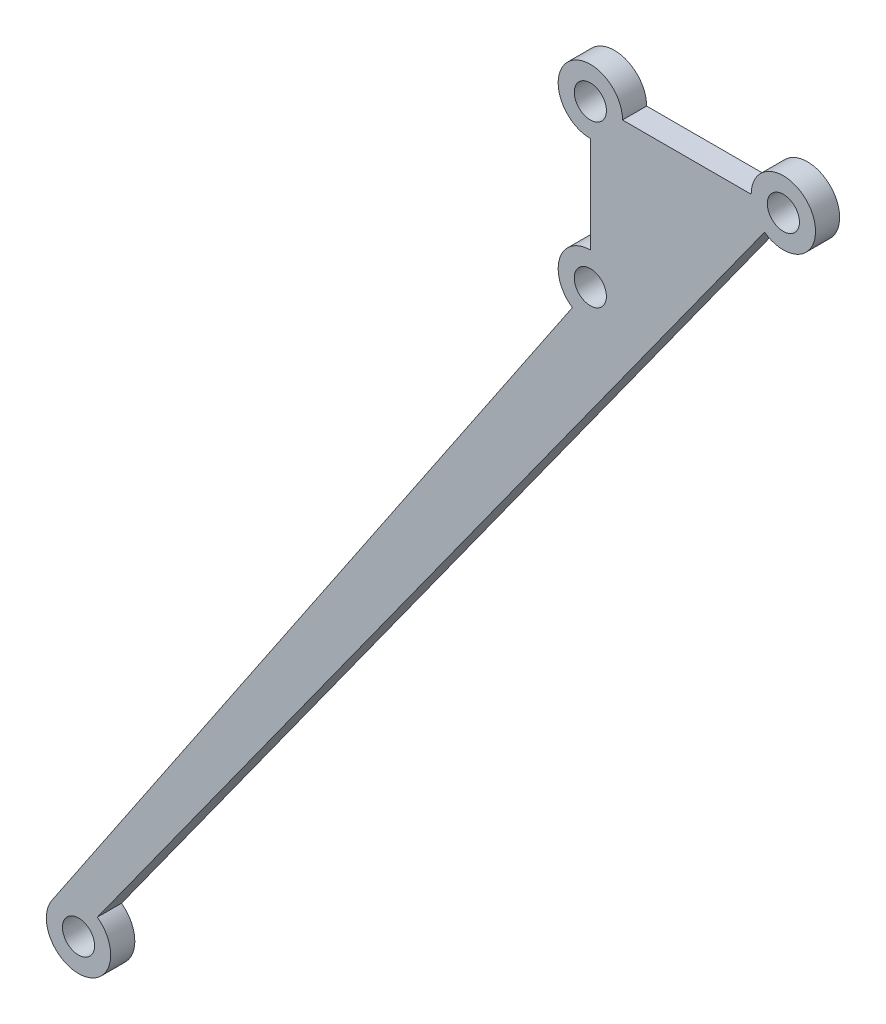
ISO-10303-21;
HEADER;
FILE_DESCRIPTION(('STEP AP214'),'2;1');
FILE_NAME('part.step','',(''),(''),'','','');
FILE_SCHEMA(('AUTOMOTIVE_DESIGN { 1 0 10303 214 1 1 1 1 }'));
ENDSEC;
DATA;
#1=APPLICATION_CONTEXT('core data for automotive mechanical design processes');
#2=APPLICATION_PROTOCOL_DEFINITION('international standard','automotive_design',2000,#1);
#3=PRODUCT_CONTEXT('',#1,'mechanical');
#4=PRODUCT('Part','Part','',(#3));
#5=PRODUCT_RELATED_PRODUCT_CATEGORY('part','',(#4));
#6=PRODUCT_DEFINITION_FORMATION('','',#4);
#7=PRODUCT_DEFINITION_CONTEXT('part definition',#1,'design');
#8=PRODUCT_DEFINITION('design','',#6,#7);
#9=PRODUCT_DEFINITION_SHAPE('','',#8);
#10=(LENGTH_UNIT() NAMED_UNIT(*) SI_UNIT(.MILLI.,.METRE.));
#11=(NAMED_UNIT(*) PLANE_ANGLE_UNIT() SI_UNIT($,.RADIAN.));
#12=(NAMED_UNIT(*) SI_UNIT($,.STERADIAN.) SOLID_ANGLE_UNIT());
#13=UNCERTAINTY_MEASURE_WITH_UNIT(LENGTH_MEASURE(1.E-05),#10,'distance_accuracy_value','');
#14=(GEOMETRIC_REPRESENTATION_CONTEXT(3) GLOBAL_UNCERTAINTY_ASSIGNED_CONTEXT((#13)) GLOBAL_UNIT_ASSIGNED_CONTEXT((#10,
#11,#12)) REPRESENTATION_CONTEXT('',''));
#15=CARTESIAN_POINT('',(0.,0.,0.));
#16=DIRECTION('',(0.,0.,1.));
#17=DIRECTION('',(1.,0.,0.));
#18=AXIS2_PLACEMENT_3D('',#15,#16,#17);
#19=CARTESIAN_POINT('',(12.,0.,1.5));
#20=DIRECTION('',(0.,0.,1.));
#21=DIRECTION('',(1.,0.,0.));
#22=AXIS2_PLACEMENT_3D('',#19,#20,#21);
#23=PLANE('',#22);
#24=CARTESIAN_POINT('',(12.,0.,1.5));
#25=DIRECTION('',(0.,0.,1.));
#26=DIRECTION('',(1.,0.,0.));
#27=AXIS2_PLACEMENT_3D('',#24,#25,#26);
#28=CIRCLE('',#27,1.);
#29=CARTESIAN_POINT('',(13.,0.,1.5));
#30=VERTEX_POINT('',#29);
#31=EDGE_CURVE('E189',#30,#30,#28,.T.);
#32=ORIENTED_EDGE('',*,*,#31,.F.);
#33=EDGE_LOOP('',(#32));
#34=FACE_BOUND('',#33,.T.);
#35=CARTESIAN_POINT('',(-31.8176448625199,-60.8688261649762,1.5));
#36=DIRECTION('',(0.,0.,1.));
#37=DIRECTION('',(1.,0.,0.));
#38=AXIS2_PLACEMENT_3D('',#35,#36,#37);
#39=CIRCLE('',#38,1.);
#40=CARTESIAN_POINT('',(-30.8176448625199,-60.8688261649762,1.5));
#41=VERTEX_POINT('',#40);
#42=EDGE_CURVE('E135',#41,#41,#39,.T.);
#43=ORIENTED_EDGE('',*,*,#42,.F.);
#44=EDGE_LOOP('',(#43));
#45=FACE_BOUND('',#44,.T.);
#46=CARTESIAN_POINT('',(12.,0.,1.5));
#47=DIRECTION('',(0.,0.,1.));
#48=DIRECTION('',(1.,0.,0.));
#49=AXIS2_PLACEMENT_3D('',#46,#47,#48);
#50=CIRCLE('',#49,2.);
#51=CARTESIAN_POINT('',(10.8315294703328,-1.6231686977327,1.5));
#52=VERTEX_POINT('',#51);
#53=CARTESIAN_POINT('',(10.,0.,1.5));
#54=VERTEX_POINT('',#53);
#55=EDGE_CURVE('E146',#52,#54,#50,.T.);
#56=ORIENTED_EDGE('',*,*,#55,.T.);
#57=DIRECTION('',(-1.,0.,0.));
#58=VECTOR('',#57,1.);
#59=CARTESIAN_POINT('',(2.,0.,1.5));
#60=LINE('',#59,#58);
#61=CARTESIAN_POINT('',(2.,0.,1.5));
#62=VERTEX_POINT('',#61);
#63=EDGE_CURVE('E94',#54,#62,#60,.T.);
#64=ORIENTED_EDGE('',*,*,#63,.T.);
#65=CARTESIAN_POINT('',(0.,0.,1.5));
#66=DIRECTION('',(0.,0.,1.));
#67=DIRECTION('',(1.,0.,0.));
#68=AXIS2_PLACEMENT_3D('',#65,#66,#67);
#69=CIRCLE('',#68,2.);
#70=CARTESIAN_POINT('',(0.,-2.,1.5));
#71=VERTEX_POINT('',#70);
#72=EDGE_CURVE('E161',#62,#71,#69,.T.);
#73=ORIENTED_EDGE('',*,*,#72,.T.);
#74=DIRECTION('',(0.,-1.,0.));
#75=VECTOR('',#74,1.);
#76=CARTESIAN_POINT('',(0.,-2.,1.5));
#77=LINE('',#76,#75);
#78=CARTESIAN_POINT('',(0.,-8.,1.5));
#79=VERTEX_POINT('',#78);
#80=EDGE_CURVE('E174',#71,#79,#77,.T.);
#81=ORIENTED_EDGE('',*,*,#80,.T.);
#82=CARTESIAN_POINT('',(0.,-10.,1.5));
#83=DIRECTION('',(0.,0.,1.));
#84=DIRECTION('',(1.,0.,0.));
#85=AXIS2_PLACEMENT_3D('',#82,#83,#84);
#86=CIRCLE('',#85,2.);
#87=CARTESIAN_POINT('',(-1.11651970063747,-11.6593323229807,1.5));
#88=VERTEX_POINT('',#87);
#89=EDGE_CURVE('E113',#79,#88,#86,.T.);
#90=ORIENTED_EDGE('',*,*,#89,.T.);
#91=DIRECTION('',(-0.558259850318737,-0.829666161490332,0.));
#92=VECTOR('',#91,1.);
#93=CARTESIAN_POINT('',(-1.11651970063747,-11.6593323229807,1.5));
#94=LINE('',#93,#92);
#95=CARTESIAN_POINT('',(-33.4769771855005,-59.7523064643387,1.5));
#96=VERTEX_POINT('',#95);
#97=EDGE_CURVE('E107',#88,#96,#94,.T.);
#98=ORIENTED_EDGE('',*,*,#97,.T.);
#99=CARTESIAN_POINT('',(-31.8176448625199,-60.8688261649762,1.5));
#100=DIRECTION('',(0.,0.,1.));
#101=DIRECTION('',(1.,0.,0.));
#102=AXIS2_PLACEMENT_3D('',#99,#100,#101);
#103=CIRCLE('',#102,2.);
#104=CARTESIAN_POINT('',(-30.6491743328527,-59.2456574672435,1.5));
#105=VERTEX_POINT('',#104);
#106=EDGE_CURVE('E111',#96,#105,#103,.T.);
#107=ORIENTED_EDGE('',*,*,#106,.T.);
#108=DIRECTION('',(0.584235264833598,0.811584348866349,0.));
#109=VECTOR('',#108,1.);
#110=CARTESIAN_POINT('',(10.8315294703328,-1.6231686977327,1.5));
#111=LINE('',#110,#109);
#112=EDGE_CURVE('E51',#105,#52,#111,.T.);
#113=ORIENTED_EDGE('',*,*,#112,.T.);
#114=EDGE_LOOP('',(#56,#64,#73,#81,#90,#98,#107,#113));
#115=FACE_BOUND('',#114,.T.);
#116=CARTESIAN_POINT('',(0.,0.,1.5));
#117=DIRECTION('',(0.,0.,1.));
#118=DIRECTION('',(1.,0.,0.));
#119=AXIS2_PLACEMENT_3D('',#116,#117,#118);
#120=CIRCLE('',#119,1.);
#121=CARTESIAN_POINT('',(1.,0.,1.5));
#122=VERTEX_POINT('',#121);
#123=EDGE_CURVE('E183',#122,#122,#120,.T.);
#124=ORIENTED_EDGE('',*,*,#123,.F.);
#125=EDGE_LOOP('',(#124));
#126=FACE_BOUND('',#125,.T.);
#127=CARTESIAN_POINT('',(0.,-10.,1.5));
#128=DIRECTION('',(0.,0.,1.));
#129=DIRECTION('',(1.,0.,0.));
#130=AXIS2_PLACEMENT_3D('',#127,#128,#129);
#131=CIRCLE('',#130,1.);
#132=CARTESIAN_POINT('',(1.,-10.,1.5));
#133=VERTEX_POINT('',#132);
#134=EDGE_CURVE('E195',#133,#133,#131,.T.);
#135=ORIENTED_EDGE('',*,*,#134,.F.);
#136=EDGE_LOOP('',(#135));
#137=FACE_BOUND('',#136,.T.);
#138=ADVANCED_FACE('F34',(#34,#45,#115,#126,#137),#23,.T.);
#139=CARTESIAN_POINT('',(12.,0.,0.));
#140=DIRECTION('',(0.,0.,1.));
#141=DIRECTION('',(1.,0.,0.));
#142=AXIS2_PLACEMENT_3D('',#139,#140,#141);
#143=PLANE('',#142);
#144=CARTESIAN_POINT('',(12.,0.,0.));
#145=DIRECTION('',(0.,0.,1.));
#146=DIRECTION('',(1.,0.,0.));
#147=AXIS2_PLACEMENT_3D('',#144,#145,#146);
#148=CIRCLE('',#147,2.);
#149=CARTESIAN_POINT('',(10.8315294703328,-1.6231686977327,0.));
#150=VERTEX_POINT('',#149);
#151=CARTESIAN_POINT('',(10.,0.,0.));
#152=VERTEX_POINT('',#151);
#153=EDGE_CURVE('E131',#150,#152,#148,.T.);
#154=ORIENTED_EDGE('',*,*,#153,.F.);
#155=DIRECTION('',(0.584235264833598,0.811584348866349,0.));
#156=VECTOR('',#155,1.);
#157=CARTESIAN_POINT('',(10.8315294703328,-1.6231686977327,0.));
#158=LINE('',#157,#156);
#159=CARTESIAN_POINT('',(-30.6491743328527,-59.2456574672435,0.));
#160=VERTEX_POINT('',#159);
#161=EDGE_CURVE('E86',#160,#150,#158,.T.);
#162=ORIENTED_EDGE('',*,*,#161,.F.);
#163=CARTESIAN_POINT('',(-31.8176448625199,-60.8688261649762,0.));
#164=DIRECTION('',(0.,0.,1.));
#165=DIRECTION('',(1.,0.,0.));
#166=AXIS2_PLACEMENT_3D('',#163,#164,#165);
#167=CIRCLE('',#166,2.);
#168=CARTESIAN_POINT('',(-33.4769771855005,-59.7523064643387,0.));
#169=VERTEX_POINT('',#168);
#170=EDGE_CURVE('E80',#169,#160,#167,.T.);
#171=ORIENTED_EDGE('',*,*,#170,.F.);
#172=DIRECTION('',(-0.558259850318737,-0.829666161490332,0.));
#173=VECTOR('',#172,1.);
#174=CARTESIAN_POINT('',(-1.11651970063747,-11.6593323229807,0.));
#175=LINE('',#174,#173);
#176=CARTESIAN_POINT('',(-1.11651970063747,-11.6593323229807,0.));
#177=VERTEX_POINT('',#176);
#178=EDGE_CURVE('E121',#177,#169,#175,.T.);
#179=ORIENTED_EDGE('',*,*,#178,.F.);
#180=CARTESIAN_POINT('',(0.,-10.,0.));
#181=DIRECTION('',(0.,0.,1.));
#182=DIRECTION('',(1.,0.,0.));
#183=AXIS2_PLACEMENT_3D('',#180,#181,#182);
#184=CIRCLE('',#183,2.);
#185=CARTESIAN_POINT('',(0.,-8.,0.));
#186=VERTEX_POINT('',#185);
#187=EDGE_CURVE('E141',#186,#177,#184,.T.);
#188=ORIENTED_EDGE('',*,*,#187,.F.);
#189=DIRECTION('',(0.,-1.,0.));
#190=VECTOR('',#189,1.);
#191=CARTESIAN_POINT('',(0.,-2.,0.));
#192=LINE('',#191,#190);
#193=CARTESIAN_POINT('',(0.,-2.,0.));
#194=VERTEX_POINT('',#193);
#195=EDGE_CURVE('E139',#194,#186,#192,.T.);
#196=ORIENTED_EDGE('',*,*,#195,.F.);
#197=CARTESIAN_POINT('',(0.,0.,0.));
#198=DIRECTION('',(0.,0.,1.));
#199=DIRECTION('',(1.,0.,0.));
#200=AXIS2_PLACEMENT_3D('',#197,#198,#199);
#201=CIRCLE('',#200,2.);
#202=CARTESIAN_POINT('',(2.,0.,0.));
#203=VERTEX_POINT('',#202);
#204=EDGE_CURVE('E137',#203,#194,#201,.T.);
#205=ORIENTED_EDGE('',*,*,#204,.F.);
#206=DIRECTION('',(-1.,0.,0.));
#207=VECTOR('',#206,1.);
#208=CARTESIAN_POINT('',(2.,0.,0.));
#209=LINE('',#208,#207);
#210=EDGE_CURVE('E134',#152,#203,#209,.T.);
#211=ORIENTED_EDGE('',*,*,#210,.F.);
#212=EDGE_LOOP('',(#154,#162,#171,#179,#188,#196,#205,#211));
#213=FACE_BOUND('',#212,.T.);
#214=CARTESIAN_POINT('',(-31.8176448625199,-60.8688261649762,0.));
#215=DIRECTION('',(0.,0.,1.));
#216=DIRECTION('',(1.,0.,0.));
#217=AXIS2_PLACEMENT_3D('',#214,#215,#216);
#218=CIRCLE('',#217,1.);
#219=CARTESIAN_POINT('',(-30.8176448625199,-60.8688261649762,0.));
#220=VERTEX_POINT('',#219);
#221=EDGE_CURVE('E180',#220,#220,#218,.T.);
#222=ORIENTED_EDGE('',*,*,#221,.T.);
#223=EDGE_LOOP('',(#222));
#224=FACE_BOUND('',#223,.T.);
#225=CARTESIAN_POINT('',(0.,0.,0.));
#226=DIRECTION('',(0.,0.,1.));
#227=DIRECTION('',(1.,0.,0.));
#228=AXIS2_PLACEMENT_3D('',#225,#226,#227);
#229=CIRCLE('',#228,1.);
#230=CARTESIAN_POINT('',(1.,0.,0.));
#231=VERTEX_POINT('',#230);
#232=EDGE_CURVE('E186',#231,#231,#229,.T.);
#233=ORIENTED_EDGE('',*,*,#232,.T.);
#234=EDGE_LOOP('',(#233));
#235=FACE_BOUND('',#234,.T.);
#236=CARTESIAN_POINT('',(12.,0.,0.));
#237=DIRECTION('',(0.,0.,1.));
#238=DIRECTION('',(1.,0.,0.));
#239=AXIS2_PLACEMENT_3D('',#236,#237,#238);
#240=CIRCLE('',#239,1.);
#241=CARTESIAN_POINT('',(13.,0.,0.));
#242=VERTEX_POINT('',#241);
#243=EDGE_CURVE('E192',#242,#242,#240,.T.);
#244=ORIENTED_EDGE('',*,*,#243,.T.);
#245=EDGE_LOOP('',(#244));
#246=FACE_BOUND('',#245,.T.);
#247=CARTESIAN_POINT('',(0.,-10.,0.));
#248=DIRECTION('',(0.,0.,1.));
#249=DIRECTION('',(1.,0.,0.));
#250=AXIS2_PLACEMENT_3D('',#247,#248,#249);
#251=CIRCLE('',#250,1.);
#252=CARTESIAN_POINT('',(1.,-10.,0.));
#253=VERTEX_POINT('',#252);
#254=EDGE_CURVE('E198',#253,#253,#251,.T.);
#255=ORIENTED_EDGE('',*,*,#254,.T.);
#256=EDGE_LOOP('',(#255));
#257=FACE_BOUND('',#256,.T.);
#258=ADVANCED_FACE('F165',(#213,#224,#235,#246,#257),#143,.F.);
#259=CARTESIAN_POINT('',(12.,0.,1.5));
#260=DIRECTION('',(0.,0.,-1.));
#261=DIRECTION('',(-1.,0.,0.));
#262=AXIS2_PLACEMENT_3D('',#259,#260,#261);
#263=CYLINDRICAL_SURFACE('',#262,2.);
#264=ORIENTED_EDGE('',*,*,#153,.T.);
#265=DIRECTION('',(0.,0.,-1.));
#266=VECTOR('',#265,1.);
#267=CARTESIAN_POINT('',(10.,0.,1.5));
#268=LINE('',#267,#266);
#269=EDGE_CURVE('E11',#54,#152,#268,.T.);
#270=ORIENTED_EDGE('',*,*,#269,.F.);
#271=ORIENTED_EDGE('',*,*,#55,.F.);
#272=DIRECTION('',(0.,0.,-1.));
#273=VECTOR('',#272,1.);
#274=CARTESIAN_POINT('',(10.8315294703328,-1.6231686977327,1.5));
#275=LINE('',#274,#273);
#276=EDGE_CURVE('E127',#52,#150,#275,.T.);
#277=ORIENTED_EDGE('',*,*,#276,.T.);
#278=EDGE_LOOP('',(#264,#270,#271,#277));
#279=FACE_BOUND('',#278,.T.);
#280=ADVANCED_FACE('F36',(#279),#263,.T.);
#281=CARTESIAN_POINT('',(2.,0.,1.5));
#282=DIRECTION('',(0.,-1.,0.));
#283=DIRECTION('',(0.,0.,-1.));
#284=AXIS2_PLACEMENT_3D('',#281,#282,#283);
#285=PLANE('',#284);
#286=ORIENTED_EDGE('',*,*,#210,.T.);
#287=DIRECTION('',(0.,0.,-1.));
#288=VECTOR('',#287,1.);
#289=CARTESIAN_POINT('',(2.,0.,1.5));
#290=LINE('',#289,#288);
#291=EDGE_CURVE('E43',#62,#203,#290,.T.);
#292=ORIENTED_EDGE('',*,*,#291,.F.);
#293=ORIENTED_EDGE('',*,*,#63,.F.);
#294=ORIENTED_EDGE('',*,*,#269,.T.);
#295=EDGE_LOOP('',(#286,#292,#293,#294));
#296=FACE_BOUND('',#295,.T.);
#297=ADVANCED_FACE('F232',(#296),#285,.F.);
#298=CARTESIAN_POINT('',(0.,0.,1.5));
#299=DIRECTION('',(0.,0.,-1.));
#300=DIRECTION('',(-1.,0.,0.));
#301=AXIS2_PLACEMENT_3D('',#298,#299,#300);
#302=CYLINDRICAL_SURFACE('',#301,2.);
#303=ORIENTED_EDGE('',*,*,#204,.T.);
#304=DIRECTION('',(0.,0.,-1.));
#305=VECTOR('',#304,1.);
#306=CARTESIAN_POINT('',(0.,-2.,1.5));
#307=LINE('',#306,#305);
#308=EDGE_CURVE('E153',#71,#194,#307,.T.);
#309=ORIENTED_EDGE('',*,*,#308,.F.);
#310=ORIENTED_EDGE('',*,*,#72,.F.);
#311=ORIENTED_EDGE('',*,*,#291,.T.);
#312=EDGE_LOOP('',(#303,#309,#310,#311));
#313=FACE_BOUND('',#312,.T.);
#314=ADVANCED_FACE('F159',(#313),#302,.T.);
#315=CARTESIAN_POINT('',(0.,-2.,1.5));
#316=DIRECTION('',(1.,0.,0.));
#317=DIRECTION('',(0.,1.,0.));
#318=AXIS2_PLACEMENT_3D('',#315,#316,#317);
#319=PLANE('',#318);
#320=ORIENTED_EDGE('',*,*,#195,.T.);
#321=DIRECTION('',(0.,0.,-1.));
#322=VECTOR('',#321,1.);
#323=CARTESIAN_POINT('',(0.,-8.,1.5));
#324=LINE('',#323,#322);
#325=EDGE_CURVE('E150',#79,#186,#324,.T.);
#326=ORIENTED_EDGE('',*,*,#325,.F.);
#327=ORIENTED_EDGE('',*,*,#80,.F.);
#328=ORIENTED_EDGE('',*,*,#308,.T.);
#329=EDGE_LOOP('',(#320,#326,#327,#328));
#330=FACE_BOUND('',#329,.T.);
#331=ADVANCED_FACE('F170',(#330),#319,.F.);
#332=CARTESIAN_POINT('',(0.,-10.,1.5));
#333=DIRECTION('',(0.,0.,-1.));
#334=DIRECTION('',(-1.,0.,0.));
#335=AXIS2_PLACEMENT_3D('',#332,#333,#334);
#336=CYLINDRICAL_SURFACE('',#335,2.);
#337=ORIENTED_EDGE('',*,*,#187,.T.);
#338=DIRECTION('',(0.,0.,-1.));
#339=VECTOR('',#338,1.);
#340=CARTESIAN_POINT('',(-1.11651970063747,-11.6593323229807,1.5));
#341=LINE('',#340,#339);
#342=EDGE_CURVE('E122',#88,#177,#341,.T.);
#343=ORIENTED_EDGE('',*,*,#342,.F.);
#344=ORIENTED_EDGE('',*,*,#89,.F.);
#345=ORIENTED_EDGE('',*,*,#325,.T.);
#346=EDGE_LOOP('',(#337,#343,#344,#345));
#347=FACE_BOUND('',#346,.T.);
#348=ADVANCED_FACE('F173',(#347),#336,.T.);
#349=CARTESIAN_POINT('',(-1.11651970063747,-11.6593323229807,1.5));
#350=DIRECTION('',(0.829666161490332,-0.558259850318737,0.));
#351=DIRECTION('',(0.558259850318737,0.829666161490332,0.));
#352=AXIS2_PLACEMENT_3D('',#349,#350,#351);
#353=PLANE('',#352);
#354=ORIENTED_EDGE('',*,*,#178,.T.);
#355=DIRECTION('',(0.,0.,-1.));
#356=VECTOR('',#355,1.);
#357=CARTESIAN_POINT('',(-33.4769771855005,-59.7523064643387,1.5));
#358=LINE('',#357,#356);
#359=EDGE_CURVE('E118',#96,#169,#358,.T.);
#360=ORIENTED_EDGE('',*,*,#359,.F.);
#361=ORIENTED_EDGE('',*,*,#97,.F.);
#362=ORIENTED_EDGE('',*,*,#342,.T.);
#363=EDGE_LOOP('',(#354,#360,#361,#362));
#364=FACE_BOUND('',#363,.T.);
#365=ADVANCED_FACE('F119',(#364),#353,.F.);
#366=CARTESIAN_POINT('',(-31.8176448625199,-60.8688261649762,1.5));
#367=DIRECTION('',(0.,0.,-1.));
#368=DIRECTION('',(-1.,0.,0.));
#369=AXIS2_PLACEMENT_3D('',#366,#367,#368);
#370=CYLINDRICAL_SURFACE('',#369,2.);
#371=ORIENTED_EDGE('',*,*,#170,.T.);
#372=DIRECTION('',(0.,0.,-1.));
#373=VECTOR('',#372,1.);
#374=CARTESIAN_POINT('',(-30.6491743328527,-59.2456574672435,1.5));
#375=LINE('',#374,#373);
#376=EDGE_CURVE('E123',#105,#160,#375,.T.);
#377=ORIENTED_EDGE('',*,*,#376,.F.);
#378=ORIENTED_EDGE('',*,*,#106,.F.);
#379=ORIENTED_EDGE('',*,*,#359,.T.);
#380=EDGE_LOOP('',(#371,#377,#378,#379));
#381=FACE_BOUND('',#380,.T.);
#382=ADVANCED_FACE('F125',(#381),#370,.T.);
#383=CARTESIAN_POINT('',(10.8315294703328,-1.6231686977327,1.5));
#384=DIRECTION('',(-0.811584348866349,0.584235264833598,0.));
#385=DIRECTION('',(-0.584235264833598,-0.811584348866349,0.));
#386=AXIS2_PLACEMENT_3D('',#383,#384,#385);
#387=PLANE('',#386);
#388=ORIENTED_EDGE('',*,*,#161,.T.);
#389=ORIENTED_EDGE('',*,*,#276,.F.);
#390=ORIENTED_EDGE('',*,*,#112,.F.);
#391=ORIENTED_EDGE('',*,*,#376,.T.);
#392=EDGE_LOOP('',(#388,#389,#390,#391));
#393=FACE_BOUND('',#392,.T.);
#394=ADVANCED_FACE('F220',(#393),#387,.F.);
#395=CARTESIAN_POINT('',(-31.8176448625199,-60.8688261649762,1.5));
#396=DIRECTION('',(0.,0.,-1.));
#397=DIRECTION('',(-1.,0.,0.));
#398=AXIS2_PLACEMENT_3D('',#395,#396,#397);
#399=CYLINDRICAL_SURFACE('',#398,1.);
#400=ORIENTED_EDGE('',*,*,#42,.T.);
#401=EDGE_LOOP('',(#400));
#402=FACE_BOUND('',#401,.T.);
#403=ORIENTED_EDGE('',*,*,#221,.F.);
#404=EDGE_LOOP('',(#403));
#405=FACE_BOUND('',#404,.T.);
#406=ADVANCED_FACE('F217',(#402,#405),#399,.F.);
#407=CARTESIAN_POINT('',(0.,0.,1.5));
#408=DIRECTION('',(0.,0.,-1.));
#409=DIRECTION('',(-1.,0.,0.));
#410=AXIS2_PLACEMENT_3D('',#407,#408,#409);
#411=CYLINDRICAL_SURFACE('',#410,1.);
#412=ORIENTED_EDGE('',*,*,#123,.T.);
#413=EDGE_LOOP('',(#412));
#414=FACE_BOUND('',#413,.T.);
#415=ORIENTED_EDGE('',*,*,#232,.F.);
#416=EDGE_LOOP('',(#415));
#417=FACE_BOUND('',#416,.T.);
#418=ADVANCED_FACE('F296',(#414,#417),#411,.F.);
#419=CARTESIAN_POINT('',(12.,0.,1.5));
#420=DIRECTION('',(0.,0.,-1.));
#421=DIRECTION('',(-1.,0.,0.));
#422=AXIS2_PLACEMENT_3D('',#419,#420,#421);
#423=CYLINDRICAL_SURFACE('',#422,1.);
#424=ORIENTED_EDGE('',*,*,#31,.T.);
#425=EDGE_LOOP('',(#424));
#426=FACE_BOUND('',#425,.T.);
#427=ORIENTED_EDGE('',*,*,#243,.F.);
#428=EDGE_LOOP('',(#427));
#429=FACE_BOUND('',#428,.T.);
#430=ADVANCED_FACE('F304',(#426,#429),#423,.F.);
#431=CARTESIAN_POINT('',(0.,-10.,1.5));
#432=DIRECTION('',(0.,0.,-1.));
#433=DIRECTION('',(-1.,0.,0.));
#434=AXIS2_PLACEMENT_3D('',#431,#432,#433);
#435=CYLINDRICAL_SURFACE('',#434,1.);
#436=ORIENTED_EDGE('',*,*,#134,.T.);
#437=EDGE_LOOP('',(#436));
#438=FACE_BOUND('',#437,.T.);
#439=ORIENTED_EDGE('',*,*,#254,.F.);
#440=EDGE_LOOP('',(#439));
#441=FACE_BOUND('',#440,.T.);
#442=ADVANCED_FACE('F204',(#438,#441),#435,.F.);
#443=CLOSED_SHELL('',(#138,#258,#280,#297,#314,#331,#348,#365,#382,#394,#406,#418,#430,#442));
#444=MANIFOLD_SOLID_BREP('B2',#443);
#445=ADVANCED_BREP_SHAPE_REPRESENTATION('',(#18,#444),#14);
#446=SHAPE_DEFINITION_REPRESENTATION(#9,#445);
ENDSEC;
END-ISO-10303-21;
